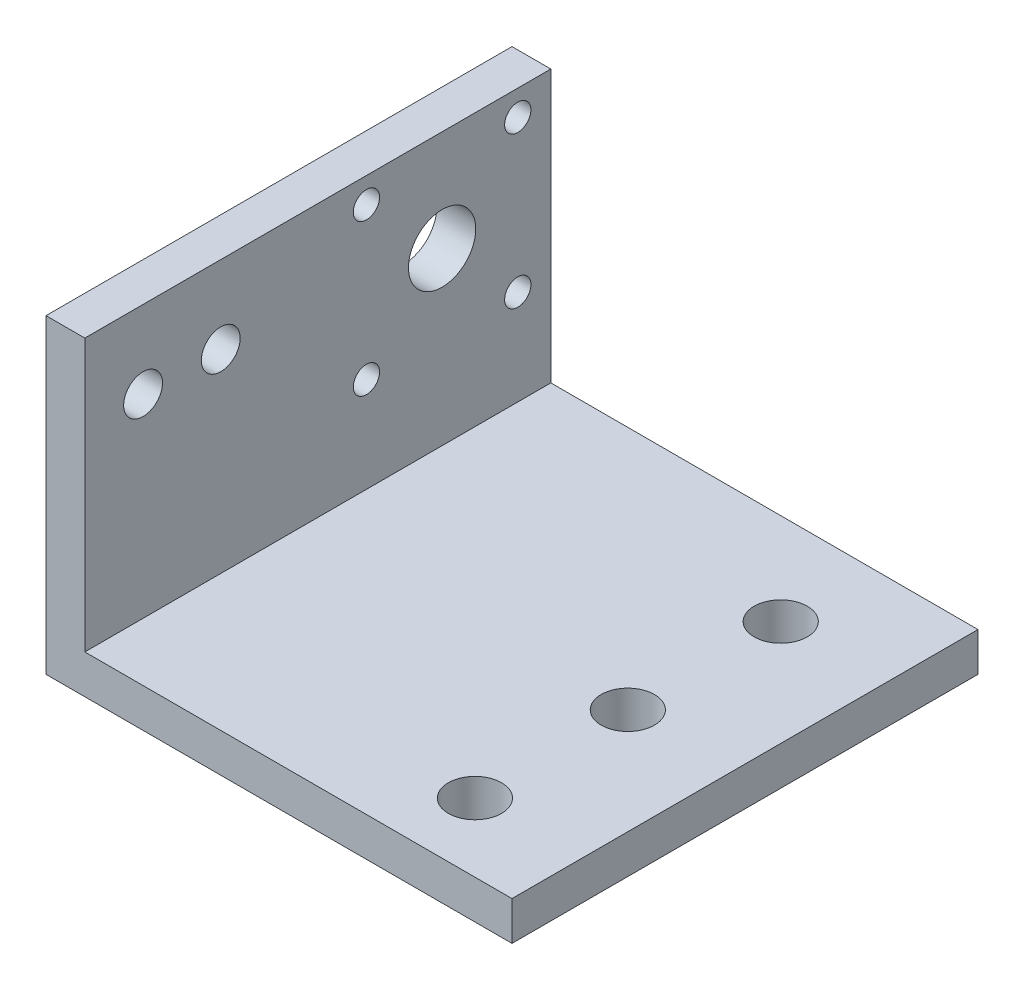
ISO-10303-21;
HEADER;
FILE_DESCRIPTION(('STEP AP214'),'2;1');
FILE_NAME('part.step','',(''),(''),'','','');
FILE_SCHEMA(('AUTOMOTIVE_DESIGN { 1 0 10303 214 1 1 1 1 }'));
ENDSEC;
DATA;
#1=APPLICATION_CONTEXT('core data for automotive mechanical design processes');
#2=APPLICATION_PROTOCOL_DEFINITION('international standard','automotive_design',2000,#1);
#3=PRODUCT_CONTEXT('',#1,'mechanical');
#4=PRODUCT('Part','Part','',(#3));
#5=PRODUCT_RELATED_PRODUCT_CATEGORY('part','',(#4));
#6=PRODUCT_DEFINITION_FORMATION('','',#4);
#7=PRODUCT_DEFINITION_CONTEXT('part definition',#1,'design');
#8=PRODUCT_DEFINITION('design','',#6,#7);
#9=PRODUCT_DEFINITION_SHAPE('','',#8);
#10=(LENGTH_UNIT() NAMED_UNIT(*) SI_UNIT(.MILLI.,.METRE.));
#11=(NAMED_UNIT(*) PLANE_ANGLE_UNIT() SI_UNIT($,.RADIAN.));
#12=(NAMED_UNIT(*) SI_UNIT($,.STERADIAN.) SOLID_ANGLE_UNIT());
#13=UNCERTAINTY_MEASURE_WITH_UNIT(LENGTH_MEASURE(1.E-05),#10,'distance_accuracy_value','');
#14=(GEOMETRIC_REPRESENTATION_CONTEXT(3) GLOBAL_UNCERTAINTY_ASSIGNED_CONTEXT((#13)) GLOBAL_UNIT_ASSIGNED_CONTEXT((#10,
#11,#12)) REPRESENTATION_CONTEXT('',''));
#15=CARTESIAN_POINT('',(0.,0.,0.));
#16=DIRECTION('',(0.,0.,1.));
#17=DIRECTION('',(1.,0.,0.));
#18=AXIS2_PLACEMENT_3D('',#15,#16,#17);
#19=CARTESIAN_POINT('',(-35.9990337511249,18.8304182639906,76.2));
#20=DIRECTION('',(-1.,0.,0.));
#21=DIRECTION('',(0.,-1.,0.));
#22=AXIS2_PLACEMENT_3D('',#19,#20,#21);
#23=PLANE('',#22);
#24=CARTESIAN_POINT('',(-35.9990337511249,6.13041826399058,66.675));
#25=DIRECTION('',(-1.,0.,0.));
#26=DIRECTION('',(0.,-1.,0.));
#27=AXIS2_PLACEMENT_3D('',#24,#25,#26);
#28=CIRCLE('',#27,3.175);
#29=CARTESIAN_POINT('',(-35.9990337511249,2.95541826399058,66.675));
#30=VERTEX_POINT('',#29);
#31=EDGE_CURVE('E290',#30,#30,#28,.F.);
#32=ORIENTED_EDGE('',*,*,#31,.F.);
#33=EDGE_LOOP('',(#32));
#34=FACE_BOUND('',#33,.T.);
#35=CARTESIAN_POINT('',(-35.9990337511249,6.13041826399058,53.975));
#36=DIRECTION('',(-1.,0.,0.));
#37=DIRECTION('',(0.,-1.,0.));
#38=AXIS2_PLACEMENT_3D('',#35,#36,#37);
#39=CIRCLE('',#38,3.175);
#40=CARTESIAN_POINT('',(-35.9990337511249,2.95541826399058,53.975));
#41=VERTEX_POINT('',#40);
#42=EDGE_CURVE('E292',#41,#41,#39,.F.);
#43=ORIENTED_EDGE('',*,*,#42,.F.);
#44=EDGE_LOOP('',(#43));
#45=FACE_BOUND('',#44,.T.);
#46=CARTESIAN_POINT('',(-35.9990337511249,2.32041826399058,17.78));
#47=DIRECTION('',(1.,0.,0.));
#48=DIRECTION('',(0.,0.,-1.));
#49=AXIS2_PLACEMENT_3D('',#46,#47,#48);
#50=CIRCLE('',#49,5.5);
#51=CARTESIAN_POINT('',(-35.9990337511249,2.32041826399058,12.28));
#52=VERTEX_POINT('',#51);
#53=EDGE_CURVE('E140',#52,#52,#50,.T.);
#54=ORIENTED_EDGE('',*,*,#53,.F.);
#55=EDGE_LOOP('',(#54));
#56=FACE_BOUND('',#55,.T.);
#57=CARTESIAN_POINT('',(-35.9990337511249,14.6952111988239,30.1547929348333));
#58=DIRECTION('',(1.,0.,0.));
#59=DIRECTION('',(0.,0.,-1.));
#60=AXIS2_PLACEMENT_3D('',#57,#58,#59);
#61=CIRCLE('',#60,2.14999999999999);
#62=CARTESIAN_POINT('',(-35.9990337511249,14.6952111988239,28.0047929348333));
#63=VERTEX_POINT('',#62);
#64=EDGE_CURVE('E139',#63,#63,#61,.T.);
#65=ORIENTED_EDGE('',*,*,#64,.F.);
#66=EDGE_LOOP('',(#65));
#67=FACE_BOUND('',#66,.T.);
#68=CARTESIAN_POINT('',(-35.9990337511249,-10.0543746708427,30.1547929348333));
#69=DIRECTION('',(1.,0.,0.));
#70=DIRECTION('',(0.,0.,-1.));
#71=AXIS2_PLACEMENT_3D('',#68,#69,#70);
#72=CIRCLE('',#71,2.14999999999999);
#73=CARTESIAN_POINT('',(-35.9990337511249,-10.0543746708427,28.0047929348333));
#74=VERTEX_POINT('',#73);
#75=EDGE_CURVE('E167',#74,#74,#72,.T.);
#76=ORIENTED_EDGE('',*,*,#75,.F.);
#77=EDGE_LOOP('',(#76));
#78=FACE_BOUND('',#77,.T.);
#79=CARTESIAN_POINT('',(-35.9990337511249,-10.0543746708427,5.40520706516671));
#80=DIRECTION('',(1.,0.,0.));
#81=DIRECTION('',(0.,0.,-1.));
#82=AXIS2_PLACEMENT_3D('',#79,#80,#81);
#83=CIRCLE('',#82,2.14999999999999);
#84=CARTESIAN_POINT('',(-35.9990337511249,-10.0543746708427,3.25520706516672));
#85=VERTEX_POINT('',#84);
#86=EDGE_CURVE('E173',#85,#85,#83,.T.);
#87=ORIENTED_EDGE('',*,*,#86,.F.);
#88=EDGE_LOOP('',(#87));
#89=FACE_BOUND('',#88,.T.);
#90=DIRECTION('',(0.,1.,0.));
#91=VECTOR('',#90,1.);
#92=CARTESIAN_POINT('',(-35.9990337511249,18.8304182639906,0.));
#93=LINE('',#92,#91);
#94=CARTESIAN_POINT('',(-35.9990337511249,-25.6195817360094,0.));
#95=VERTEX_POINT('',#94);
#96=CARTESIAN_POINT('',(-35.9990337511249,18.8304182639906,0.));
#97=VERTEX_POINT('',#96);
#98=EDGE_CURVE('E80',#95,#97,#93,.T.);
#99=ORIENTED_EDGE('',*,*,#98,.T.);
#100=DIRECTION('',(0.,0.,-1.));
#101=VECTOR('',#100,1.);
#102=CARTESIAN_POINT('',(-35.9990337511249,18.8304182639906,76.2));
#103=LINE('',#102,#101);
#104=CARTESIAN_POINT('',(-35.9990337511249,18.8304182639906,76.2));
#105=VERTEX_POINT('',#104);
#106=EDGE_CURVE('E115',#105,#97,#103,.T.);
#107=ORIENTED_EDGE('',*,*,#106,.F.);
#108=DIRECTION('',(0.,1.,0.));
#109=VECTOR('',#108,1.);
#110=CARTESIAN_POINT('',(-35.9990337511249,18.8304182639906,76.2));
#111=LINE('',#110,#109);
#112=CARTESIAN_POINT('',(-35.9990337511249,-25.6195817360094,76.2));
#113=VERTEX_POINT('',#112);
#114=EDGE_CURVE('E51',#113,#105,#111,.T.);
#115=ORIENTED_EDGE('',*,*,#114,.F.);
#116=DIRECTION('',(0.,0.,-1.));
#117=VECTOR('',#116,1.);
#118=CARTESIAN_POINT('',(-35.9990337511249,-25.6195817360094,76.2));
#119=LINE('',#118,#117);
#120=EDGE_CURVE('E111',#113,#95,#119,.T.);
#121=ORIENTED_EDGE('',*,*,#120,.T.);
#122=EDGE_LOOP('',(#99,#107,#115,#121));
#123=FACE_BOUND('',#122,.T.);
#124=CARTESIAN_POINT('',(-35.9990337511249,14.6952111988239,5.40520706516671));
#125=DIRECTION('',(1.,0.,0.));
#126=DIRECTION('',(0.,0.,-1.));
#127=AXIS2_PLACEMENT_3D('',#124,#125,#126);
#128=CIRCLE('',#127,2.14999999999999);
#129=CARTESIAN_POINT('',(-35.9990337511249,14.6952111988239,3.25520706516672));
#130=VERTEX_POINT('',#129);
#131=EDGE_CURVE('E179',#130,#130,#128,.T.);
#132=ORIENTED_EDGE('',*,*,#131,.F.);
#133=EDGE_LOOP('',(#132));
#134=FACE_BOUND('',#133,.T.);
#135=ADVANCED_FACE('F32',(#34,#45,#56,#67,#78,#89,#123,#134),#23,.F.);
#136=CARTESIAN_POINT('',(-42.3490337511249,18.8304182639906,76.2));
#137=DIRECTION('',(0.,-1.,0.));
#138=DIRECTION('',(0.,0.,-1.));
#139=AXIS2_PLACEMENT_3D('',#136,#137,#138);
#140=PLANE('',#139);
#141=DIRECTION('',(-1.,0.,0.));
#142=VECTOR('',#141,1.);
#143=CARTESIAN_POINT('',(-42.3490337511249,18.8304182639906,0.));
#144=LINE('',#143,#142);
#145=CARTESIAN_POINT('',(-42.3490337511249,18.8304182639906,0.));
#146=VERTEX_POINT('',#145);
#147=EDGE_CURVE('E119',#97,#146,#144,.T.);
#148=ORIENTED_EDGE('',*,*,#147,.T.);
#149=DIRECTION('',(0.,0.,-1.));
#150=VECTOR('',#149,1.);
#151=CARTESIAN_POINT('',(-42.3490337511249,18.8304182639906,76.2));
#152=LINE('',#151,#150);
#153=CARTESIAN_POINT('',(-42.3490337511249,18.8304182639906,76.2));
#154=VERTEX_POINT('',#153);
#155=EDGE_CURVE('E11',#154,#146,#152,.T.);
#156=ORIENTED_EDGE('',*,*,#155,.F.);
#157=DIRECTION('',(-1.,0.,0.));
#158=VECTOR('',#157,1.);
#159=CARTESIAN_POINT('',(-42.3490337511249,18.8304182639906,76.2));
#160=LINE('',#159,#158);
#161=EDGE_CURVE('E130',#105,#154,#160,.T.);
#162=ORIENTED_EDGE('',*,*,#161,.F.);
#163=ORIENTED_EDGE('',*,*,#106,.T.);
#164=EDGE_LOOP('',(#148,#156,#162,#163));
#165=FACE_BOUND('',#164,.T.);
#166=ADVANCED_FACE('F34',(#165),#140,.F.);
#167=CARTESIAN_POINT('',(-42.3490337511249,18.8304182639906,76.2));
#168=DIRECTION('',(1.,0.,0.));
#169=DIRECTION('',(0.,1.,0.));
#170=AXIS2_PLACEMENT_3D('',#167,#168,#169);
#171=PLANE('',#170);
#172=CARTESIAN_POINT('',(-42.3490337511249,6.13041826399058,66.675));
#173=DIRECTION('',(-1.,0.,0.));
#174=DIRECTION('',(0.,-1.,0.));
#175=AXIS2_PLACEMENT_3D('',#172,#173,#174);
#176=CIRCLE('',#175,3.175);
#177=CARTESIAN_POINT('',(-42.3490337511249,2.95541826399058,66.675));
#178=VERTEX_POINT('',#177);
#179=EDGE_CURVE('E235',#178,#178,#176,.T.);
#180=ORIENTED_EDGE('',*,*,#179,.F.);
#181=EDGE_LOOP('',(#180));
#182=FACE_BOUND('',#181,.T.);
#183=CARTESIAN_POINT('',(-42.3490337511249,6.13041826399058,53.975));
#184=DIRECTION('',(-1.,0.,0.));
#185=DIRECTION('',(0.,-1.,0.));
#186=AXIS2_PLACEMENT_3D('',#183,#184,#185);
#187=CIRCLE('',#186,3.175);
#188=CARTESIAN_POINT('',(-42.3490337511249,2.95541826399058,53.975));
#189=VERTEX_POINT('',#188);
#190=EDGE_CURVE('E239',#189,#189,#187,.T.);
#191=ORIENTED_EDGE('',*,*,#190,.F.);
#192=EDGE_LOOP('',(#191));
#193=FACE_BOUND('',#192,.T.);
#194=CARTESIAN_POINT('',(-42.3490337511249,2.32041826399058,17.78));
#195=DIRECTION('',(1.,0.,0.));
#196=DIRECTION('',(0.,1.,0.));
#197=AXIS2_PLACEMENT_3D('',#194,#195,#196);
#198=CIRCLE('',#197,5.5);
#199=CARTESIAN_POINT('',(-42.3490337511249,7.82041826399058,17.78));
#200=VERTEX_POINT('',#199);
#201=EDGE_CURVE('E136',#200,#200,#198,.T.);
#202=ORIENTED_EDGE('',*,*,#201,.T.);
#203=EDGE_LOOP('',(#202));
#204=FACE_BOUND('',#203,.T.);
#205=CARTESIAN_POINT('',(-42.3490337511249,14.6952111988239,30.1547929348333));
#206=DIRECTION('',(1.,0.,0.));
#207=DIRECTION('',(0.,1.,0.));
#208=AXIS2_PLACEMENT_3D('',#205,#206,#207);
#209=CIRCLE('',#208,2.14999999999999);
#210=CARTESIAN_POINT('',(-42.3490337511249,16.8452111988239,30.1547929348333));
#211=VERTEX_POINT('',#210);
#212=EDGE_CURVE('E164',#211,#211,#209,.T.);
#213=ORIENTED_EDGE('',*,*,#212,.T.);
#214=EDGE_LOOP('',(#213));
#215=FACE_BOUND('',#214,.T.);
#216=CARTESIAN_POINT('',(-42.3490337511249,-10.0543746708427,30.1547929348333));
#217=DIRECTION('',(1.,0.,0.));
#218=DIRECTION('',(0.,1.,0.));
#219=AXIS2_PLACEMENT_3D('',#216,#217,#218);
#220=CIRCLE('',#219,2.14999999999999);
#221=CARTESIAN_POINT('',(-42.3490337511249,-7.90437467084273,30.1547929348333));
#222=VERTEX_POINT('',#221);
#223=EDGE_CURVE('E170',#222,#222,#220,.T.);
#224=ORIENTED_EDGE('',*,*,#223,.T.);
#225=EDGE_LOOP('',(#224));
#226=FACE_BOUND('',#225,.T.);
#227=CARTESIAN_POINT('',(-42.3490337511249,-10.0543746708427,5.40520706516671));
#228=DIRECTION('',(1.,0.,0.));
#229=DIRECTION('',(0.,1.,0.));
#230=AXIS2_PLACEMENT_3D('',#227,#228,#229);
#231=CIRCLE('',#230,2.14999999999999);
#232=CARTESIAN_POINT('',(-42.3490337511249,-7.90437467084272,5.40520706516671));
#233=VERTEX_POINT('',#232);
#234=EDGE_CURVE('E176',#233,#233,#231,.T.);
#235=ORIENTED_EDGE('',*,*,#234,.T.);
#236=EDGE_LOOP('',(#235));
#237=FACE_BOUND('',#236,.T.);
#238=CARTESIAN_POINT('',(-42.3490337511249,14.6952111988239,5.40520706516671));
#239=DIRECTION('',(1.,0.,0.));
#240=DIRECTION('',(0.,1.,0.));
#241=AXIS2_PLACEMENT_3D('',#238,#239,#240);
#242=CIRCLE('',#241,2.14999999999999);
#243=CARTESIAN_POINT('',(-42.3490337511249,16.8452111988239,5.40520706516671));
#244=VERTEX_POINT('',#243);
#245=EDGE_CURVE('E123',#244,#244,#242,.T.);
#246=ORIENTED_EDGE('',*,*,#245,.T.);
#247=EDGE_LOOP('',(#246));
#248=FACE_BOUND('',#247,.T.);
#249=DIRECTION('',(0.,-1.,0.));
#250=VECTOR('',#249,1.);
#251=CARTESIAN_POINT('',(-42.3490337511249,18.8304182639906,0.));
#252=LINE('',#251,#250);
#253=CARTESIAN_POINT('',(-42.3490337511249,-31.9695817360094,0.));
#254=VERTEX_POINT('',#253);
#255=EDGE_CURVE('E122',#146,#254,#252,.T.);
#256=ORIENTED_EDGE('',*,*,#255,.T.);
#257=DIRECTION('',(0.,0.,-1.));
#258=VECTOR('',#257,1.);
#259=CARTESIAN_POINT('',(-42.3490337511249,-31.9695817360094,76.2));
#260=LINE('',#259,#258);
#261=CARTESIAN_POINT('',(-42.3490337511249,-31.9695817360094,76.2));
#262=VERTEX_POINT('',#261);
#263=EDGE_CURVE('E42',#262,#254,#260,.T.);
#264=ORIENTED_EDGE('',*,*,#263,.F.);
#265=DIRECTION('',(0.,-1.,0.));
#266=VECTOR('',#265,1.);
#267=CARTESIAN_POINT('',(-42.3490337511249,18.8304182639906,76.2));
#268=LINE('',#267,#266);
#269=EDGE_CURVE('E88',#154,#262,#268,.T.);
#270=ORIENTED_EDGE('',*,*,#269,.F.);
#271=ORIENTED_EDGE('',*,*,#155,.T.);
#272=EDGE_LOOP('',(#256,#264,#270,#271));
#273=FACE_BOUND('',#272,.T.);
#274=ADVANCED_FACE('F187',(#182,#193,#204,#215,#226,#237,#248,#273),#171,.F.);
#275=CARTESIAN_POINT('',(-42.3490337511249,-31.9695817360094,76.2));
#276=DIRECTION('',(0.,1.,0.));
#277=DIRECTION('',(0.,0.,1.));
#278=AXIS2_PLACEMENT_3D('',#275,#276,#277);
#279=PLANE('',#278);
#280=CARTESIAN_POINT('',(16.5912662488751,-31.9695817360094,40.));
#281=DIRECTION('',(0.,-1.,0.));
#282=DIRECTION('',(0.,0.,-1.));
#283=AXIS2_PLACEMENT_3D('',#280,#281,#282);
#284=CIRCLE('',#283,4.35);
#285=CARTESIAN_POINT('',(16.5912662488751,-31.9695817360094,35.65));
#286=VERTEX_POINT('',#285);
#287=EDGE_CURVE('E156',#286,#286,#284,.T.);
#288=ORIENTED_EDGE('',*,*,#287,.F.);
#289=EDGE_LOOP('',(#288));
#290=FACE_BOUND('',#289,.T.);
#291=CARTESIAN_POINT('',(16.5912662488751,-31.9695817360094,15.));
#292=DIRECTION('',(0.,-1.,0.));
#293=DIRECTION('',(0.,0.,-1.));
#294=AXIS2_PLACEMENT_3D('',#291,#292,#293);
#295=CIRCLE('',#294,4.35);
#296=CARTESIAN_POINT('',(16.5912662488751,-31.9695817360094,10.65));
#297=VERTEX_POINT('',#296);
#298=EDGE_CURVE('E146',#297,#297,#295,.T.);
#299=ORIENTED_EDGE('',*,*,#298,.F.);
#300=EDGE_LOOP('',(#299));
#301=FACE_BOUND('',#300,.T.);
#302=CARTESIAN_POINT('',(16.5912662488751,-31.9695817360094,65.));
#303=DIRECTION('',(0.,-1.,0.));
#304=DIRECTION('',(0.,0.,-1.));
#305=AXIS2_PLACEMENT_3D('',#302,#303,#304);
#306=CIRCLE('',#305,4.34999999999996);
#307=CARTESIAN_POINT('',(16.5912662488751,-31.9695817360094,60.65));
#308=VERTEX_POINT('',#307);
#309=EDGE_CURVE('E143',#308,#308,#306,.T.);
#310=ORIENTED_EDGE('',*,*,#309,.F.);
#311=EDGE_LOOP('',(#310));
#312=FACE_BOUND('',#311,.T.);
#313=DIRECTION('',(1.,0.,0.));
#314=VECTOR('',#313,1.);
#315=CARTESIAN_POINT('',(-42.3490337511249,-31.9695817360094,0.));
#316=LINE('',#315,#314);
#317=CARTESIAN_POINT('',(33.8509662488751,-31.9695817360094,0.));
#318=VERTEX_POINT('',#317);
#319=EDGE_CURVE('E125',#254,#318,#316,.T.);
#320=ORIENTED_EDGE('',*,*,#319,.T.);
#321=DIRECTION('',(0.,0.,-1.));
#322=VECTOR('',#321,1.);
#323=CARTESIAN_POINT('',(33.8509662488751,-31.9695817360094,76.2));
#324=LINE('',#323,#322);
#325=CARTESIAN_POINT('',(33.8509662488751,-31.9695817360094,76.2));
#326=VERTEX_POINT('',#325);
#327=EDGE_CURVE('E110',#326,#318,#324,.T.);
#328=ORIENTED_EDGE('',*,*,#327,.F.);
#329=DIRECTION('',(1.,0.,0.));
#330=VECTOR('',#329,1.);
#331=CARTESIAN_POINT('',(-42.3490337511249,-31.9695817360094,76.2));
#332=LINE('',#331,#330);
#333=EDGE_CURVE('E101',#262,#326,#332,.T.);
#334=ORIENTED_EDGE('',*,*,#333,.F.);
#335=ORIENTED_EDGE('',*,*,#263,.T.);
#336=EDGE_LOOP('',(#320,#328,#334,#335));
#337=FACE_BOUND('',#336,.T.);
#338=ADVANCED_FACE('F190',(#290,#301,#312,#337),#279,.F.);
#339=CARTESIAN_POINT('',(33.8509662488751,-25.6195817360094,76.2));
#340=DIRECTION('',(-1.,0.,0.));
#341=DIRECTION('',(0.,0.,1.));
#342=AXIS2_PLACEMENT_3D('',#339,#340,#341);
#343=PLANE('',#342);
#344=DIRECTION('',(0.,1.,0.));
#345=VECTOR('',#344,1.);
#346=CARTESIAN_POINT('',(33.8509662488751,-25.6195817360094,0.));
#347=LINE('',#346,#345);
#348=CARTESIAN_POINT('',(33.8509662488751,-25.6195817360094,0.));
#349=VERTEX_POINT('',#348);
#350=EDGE_CURVE('E109',#318,#349,#347,.T.);
#351=ORIENTED_EDGE('',*,*,#350,.T.);
#352=DIRECTION('',(0.,0.,-1.));
#353=VECTOR('',#352,1.);
#354=CARTESIAN_POINT('',(33.8509662488751,-25.6195817360094,76.2));
#355=LINE('',#354,#353);
#356=CARTESIAN_POINT('',(33.8509662488751,-25.6195817360094,76.2));
#357=VERTEX_POINT('',#356);
#358=EDGE_CURVE('E106',#357,#349,#355,.T.);
#359=ORIENTED_EDGE('',*,*,#358,.F.);
#360=DIRECTION('',(0.,1.,0.));
#361=VECTOR('',#360,1.);
#362=CARTESIAN_POINT('',(33.8509662488751,-25.6195817360094,76.2));
#363=LINE('',#362,#361);
#364=EDGE_CURVE('E95',#326,#357,#363,.T.);
#365=ORIENTED_EDGE('',*,*,#364,.F.);
#366=ORIENTED_EDGE('',*,*,#327,.T.);
#367=EDGE_LOOP('',(#351,#359,#365,#366));
#368=FACE_BOUND('',#367,.T.);
#369=ADVANCED_FACE('F107',(#368),#343,.F.);
#370=CARTESIAN_POINT('',(-35.9990337511249,-25.6195817360094,76.2));
#371=DIRECTION('',(0.,-1.,0.));
#372=DIRECTION('',(0.,0.,-1.));
#373=AXIS2_PLACEMENT_3D('',#370,#371,#372);
#374=PLANE('',#373);
#375=CARTESIAN_POINT('',(16.5912662488751,-25.6195817360094,40.));
#376=DIRECTION('',(0.,-1.,0.));
#377=DIRECTION('',(0.,0.,-1.));
#378=AXIS2_PLACEMENT_3D('',#375,#376,#377);
#379=CIRCLE('',#378,4.35);
#380=CARTESIAN_POINT('',(16.5912662488751,-25.6195817360094,35.65));
#381=VERTEX_POINT('',#380);
#382=EDGE_CURVE('E36',#381,#381,#379,.T.);
#383=ORIENTED_EDGE('',*,*,#382,.T.);
#384=EDGE_LOOP('',(#383));
#385=FACE_BOUND('',#384,.T.);
#386=CARTESIAN_POINT('',(16.5912662488751,-25.6195817360094,15.));
#387=DIRECTION('',(0.,-1.,0.));
#388=DIRECTION('',(0.,0.,-1.));
#389=AXIS2_PLACEMENT_3D('',#386,#387,#388);
#390=CIRCLE('',#389,4.35);
#391=CARTESIAN_POINT('',(16.5912662488751,-25.6195817360094,10.65));
#392=VERTEX_POINT('',#391);
#393=EDGE_CURVE('E144',#392,#392,#390,.T.);
#394=ORIENTED_EDGE('',*,*,#393,.T.);
#395=EDGE_LOOP('',(#394));
#396=FACE_BOUND('',#395,.T.);
#397=CARTESIAN_POINT('',(16.5912662488751,-25.6195817360094,65.));
#398=DIRECTION('',(0.,-1.,0.));
#399=DIRECTION('',(0.,0.,-1.));
#400=AXIS2_PLACEMENT_3D('',#397,#398,#399);
#401=CIRCLE('',#400,4.34999999999996);
#402=CARTESIAN_POINT('',(16.5912662488751,-25.6195817360094,60.65));
#403=VERTEX_POINT('',#402);
#404=EDGE_CURVE('E141',#403,#403,#401,.T.);
#405=ORIENTED_EDGE('',*,*,#404,.T.);
#406=EDGE_LOOP('',(#405));
#407=FACE_BOUND('',#406,.T.);
#408=DIRECTION('',(-1.,0.,0.));
#409=VECTOR('',#408,1.);
#410=CARTESIAN_POINT('',(-35.9990337511249,-25.6195817360094,0.));
#411=LINE('',#410,#409);
#412=EDGE_CURVE('E74',#349,#95,#411,.T.);
#413=ORIENTED_EDGE('',*,*,#412,.T.);
#414=ORIENTED_EDGE('',*,*,#120,.F.);
#415=DIRECTION('',(-1.,0.,0.));
#416=VECTOR('',#415,1.);
#417=CARTESIAN_POINT('',(-35.9990337511249,-25.6195817360094,76.2));
#418=LINE('',#417,#416);
#419=EDGE_CURVE('E99',#357,#113,#418,.T.);
#420=ORIENTED_EDGE('',*,*,#419,.F.);
#421=ORIENTED_EDGE('',*,*,#358,.T.);
#422=EDGE_LOOP('',(#413,#414,#420,#421));
#423=FACE_BOUND('',#422,.T.);
#424=ADVANCED_FACE('F113',(#385,#396,#407,#423),#374,.F.);
#425=CARTESIAN_POINT('',(0.,0.,76.2));
#426=DIRECTION('',(0.,0.,-1.));
#427=DIRECTION('',(-1.,0.,0.));
#428=AXIS2_PLACEMENT_3D('',#425,#426,#427);
#429=PLANE('',#428);
#430=ORIENTED_EDGE('',*,*,#161,.T.);
#431=ORIENTED_EDGE('',*,*,#269,.T.);
#432=ORIENTED_EDGE('',*,*,#333,.T.);
#433=ORIENTED_EDGE('',*,*,#364,.T.);
#434=ORIENTED_EDGE('',*,*,#419,.T.);
#435=ORIENTED_EDGE('',*,*,#114,.T.);
#436=EDGE_LOOP('',(#430,#431,#432,#433,#434,#435));
#437=FACE_BOUND('',#436,.T.);
#438=ADVANCED_FACE('F97',(#437),#429,.F.);
#439=CARTESIAN_POINT('',(0.,0.,0.));
#440=DIRECTION('',(0.,0.,-1.));
#441=DIRECTION('',(-1.,0.,0.));
#442=AXIS2_PLACEMENT_3D('',#439,#440,#441);
#443=PLANE('',#442);
#444=ORIENTED_EDGE('',*,*,#147,.F.);
#445=ORIENTED_EDGE('',*,*,#98,.F.);
#446=ORIENTED_EDGE('',*,*,#412,.F.);
#447=ORIENTED_EDGE('',*,*,#350,.F.);
#448=ORIENTED_EDGE('',*,*,#319,.F.);
#449=ORIENTED_EDGE('',*,*,#255,.F.);
#450=EDGE_LOOP('',(#444,#445,#446,#447,#448,#449));
#451=FACE_BOUND('',#450,.T.);
#452=ADVANCED_FACE('F193',(#451),#443,.T.);
#453=CARTESIAN_POINT('',(-35.9990337511249,14.6952111988239,5.40520706516671));
#454=DIRECTION('',(1.,0.,0.));
#455=DIRECTION('',(0.,0.,-1.));
#456=AXIS2_PLACEMENT_3D('',#453,#454,#455);
#457=CYLINDRICAL_SURFACE('',#456,2.14999999999999);
#458=ORIENTED_EDGE('',*,*,#245,.F.);
#459=EDGE_LOOP('',(#458));
#460=FACE_BOUND('',#459,.T.);
#461=ORIENTED_EDGE('',*,*,#131,.T.);
#462=EDGE_LOOP('',(#461));
#463=FACE_BOUND('',#462,.T.);
#464=ADVANCED_FACE('F201',(#460,#463),#457,.F.);
#465=CARTESIAN_POINT('',(-35.9990337511249,-10.0543746708427,5.40520706516671));
#466=DIRECTION('',(1.,0.,0.));
#467=DIRECTION('',(0.,0.,-1.));
#468=AXIS2_PLACEMENT_3D('',#465,#466,#467);
#469=CYLINDRICAL_SURFACE('',#468,2.14999999999999);
#470=ORIENTED_EDGE('',*,*,#234,.F.);
#471=EDGE_LOOP('',(#470));
#472=FACE_BOUND('',#471,.T.);
#473=ORIENTED_EDGE('',*,*,#86,.T.);
#474=EDGE_LOOP('',(#473));
#475=FACE_BOUND('',#474,.T.);
#476=ADVANCED_FACE('F203',(#472,#475),#469,.F.);
#477=CARTESIAN_POINT('',(-35.9990337511249,-10.0543746708427,30.1547929348333));
#478=DIRECTION('',(1.,0.,0.));
#479=DIRECTION('',(0.,0.,-1.));
#480=AXIS2_PLACEMENT_3D('',#477,#478,#479);
#481=CYLINDRICAL_SURFACE('',#480,2.14999999999999);
#482=ORIENTED_EDGE('',*,*,#223,.F.);
#483=EDGE_LOOP('',(#482));
#484=FACE_BOUND('',#483,.T.);
#485=ORIENTED_EDGE('',*,*,#75,.T.);
#486=EDGE_LOOP('',(#485));
#487=FACE_BOUND('',#486,.T.);
#488=ADVANCED_FACE('F210',(#484,#487),#481,.F.);
#489=CARTESIAN_POINT('',(-35.9990337511249,14.6952111988239,30.1547929348333));
#490=DIRECTION('',(1.,0.,0.));
#491=DIRECTION('',(0.,0.,-1.));
#492=AXIS2_PLACEMENT_3D('',#489,#490,#491);
#493=CYLINDRICAL_SURFACE('',#492,2.14999999999999);
#494=ORIENTED_EDGE('',*,*,#212,.F.);
#495=EDGE_LOOP('',(#494));
#496=FACE_BOUND('',#495,.T.);
#497=ORIENTED_EDGE('',*,*,#64,.T.);
#498=EDGE_LOOP('',(#497));
#499=FACE_BOUND('',#498,.T.);
#500=ADVANCED_FACE('F254',(#496,#499),#493,.F.);
#501=CARTESIAN_POINT('',(-44.6350337511249,2.32041826399058,17.78));
#502=DIRECTION('',(1.,0.,0.));
#503=DIRECTION('',(0.,0.,-1.));
#504=AXIS2_PLACEMENT_3D('',#501,#502,#503);
#505=CYLINDRICAL_SURFACE('',#504,5.5);
#506=ORIENTED_EDGE('',*,*,#53,.T.);
#507=EDGE_LOOP('',(#506));
#508=FACE_BOUND('',#507,.T.);
#509=ORIENTED_EDGE('',*,*,#201,.F.);
#510=EDGE_LOOP('',(#509));
#511=FACE_BOUND('',#510,.T.);
#512=ADVANCED_FACE('F260',(#508,#511),#505,.F.);
#513=CARTESIAN_POINT('',(16.5912662488751,-17.9995817360094,65.));
#514=DIRECTION('',(0.,-1.,0.));
#515=DIRECTION('',(0.,0.,-1.));
#516=AXIS2_PLACEMENT_3D('',#513,#514,#515);
#517=CYLINDRICAL_SURFACE('',#516,4.34999999999996);
#518=ORIENTED_EDGE('',*,*,#309,.T.);
#519=EDGE_LOOP('',(#518));
#520=FACE_BOUND('',#519,.T.);
#521=ORIENTED_EDGE('',*,*,#404,.F.);
#522=EDGE_LOOP('',(#521));
#523=FACE_BOUND('',#522,.T.);
#524=ADVANCED_FACE('F266',(#520,#523),#517,.F.);
#525=CARTESIAN_POINT('',(16.5912662488751,-17.9995817360094,15.));
#526=DIRECTION('',(0.,-1.,0.));
#527=DIRECTION('',(0.,0.,-1.));
#528=AXIS2_PLACEMENT_3D('',#525,#526,#527);
#529=CYLINDRICAL_SURFACE('',#528,4.35);
#530=ORIENTED_EDGE('',*,*,#298,.T.);
#531=EDGE_LOOP('',(#530));
#532=FACE_BOUND('',#531,.T.);
#533=ORIENTED_EDGE('',*,*,#393,.F.);
#534=EDGE_LOOP('',(#533));
#535=FACE_BOUND('',#534,.T.);
#536=ADVANCED_FACE('F270',(#532,#535),#529,.F.);
#537=CARTESIAN_POINT('',(16.5912662488751,-17.9995817360094,40.));
#538=DIRECTION('',(0.,-1.,0.));
#539=DIRECTION('',(0.,0.,-1.));
#540=AXIS2_PLACEMENT_3D('',#537,#538,#539);
#541=CYLINDRICAL_SURFACE('',#540,4.35);
#542=ORIENTED_EDGE('',*,*,#287,.T.);
#543=EDGE_LOOP('',(#542));
#544=FACE_BOUND('',#543,.T.);
#545=ORIENTED_EDGE('',*,*,#382,.F.);
#546=EDGE_LOOP('',(#545));
#547=FACE_BOUND('',#546,.T.);
#548=ADVANCED_FACE('F274',(#544,#547),#541,.F.);
#549=CARTESIAN_POINT('',(33.8519662488751,6.13041826399059,53.975));
#550=DIRECTION('',(-1.,0.,0.));
#551=DIRECTION('',(0.,-1.,0.));
#552=AXIS2_PLACEMENT_3D('',#549,#550,#551);
#553=CYLINDRICAL_SURFACE('',#552,3.175);
#554=ORIENTED_EDGE('',*,*,#190,.T.);
#555=EDGE_LOOP('',(#554));
#556=FACE_BOUND('',#555,.T.);
#557=ORIENTED_EDGE('',*,*,#42,.T.);
#558=EDGE_LOOP('',(#557));
#559=FACE_BOUND('',#558,.T.);
#560=ADVANCED_FACE('F277',(#556,#559),#553,.F.);
#561=CARTESIAN_POINT('',(33.8519662488751,6.13041826399059,66.675));
#562=DIRECTION('',(-1.,0.,0.));
#563=DIRECTION('',(0.,-1.,0.));
#564=AXIS2_PLACEMENT_3D('',#561,#562,#563);
#565=CYLINDRICAL_SURFACE('',#564,3.175);
#566=ORIENTED_EDGE('',*,*,#179,.T.);
#567=EDGE_LOOP('',(#566));
#568=FACE_BOUND('',#567,.T.);
#569=ORIENTED_EDGE('',*,*,#31,.T.);
#570=EDGE_LOOP('',(#569));
#571=FACE_BOUND('',#570,.T.);
#572=ADVANCED_FACE('F281',(#568,#571),#565,.F.);
#573=CLOSED_SHELL('',(#135,#166,#274,#338,#369,#424,#438,#452,#464,#476,#488,#500,#512,#524,
#536,#548,#560,#572));
#574=MANIFOLD_SOLID_BREP('B2',#573);
#575=ADVANCED_BREP_SHAPE_REPRESENTATION('',(#18,#574),#14);
#576=SHAPE_DEFINITION_REPRESENTATION(#9,#575);
ENDSEC;
END-ISO-10303-21;
